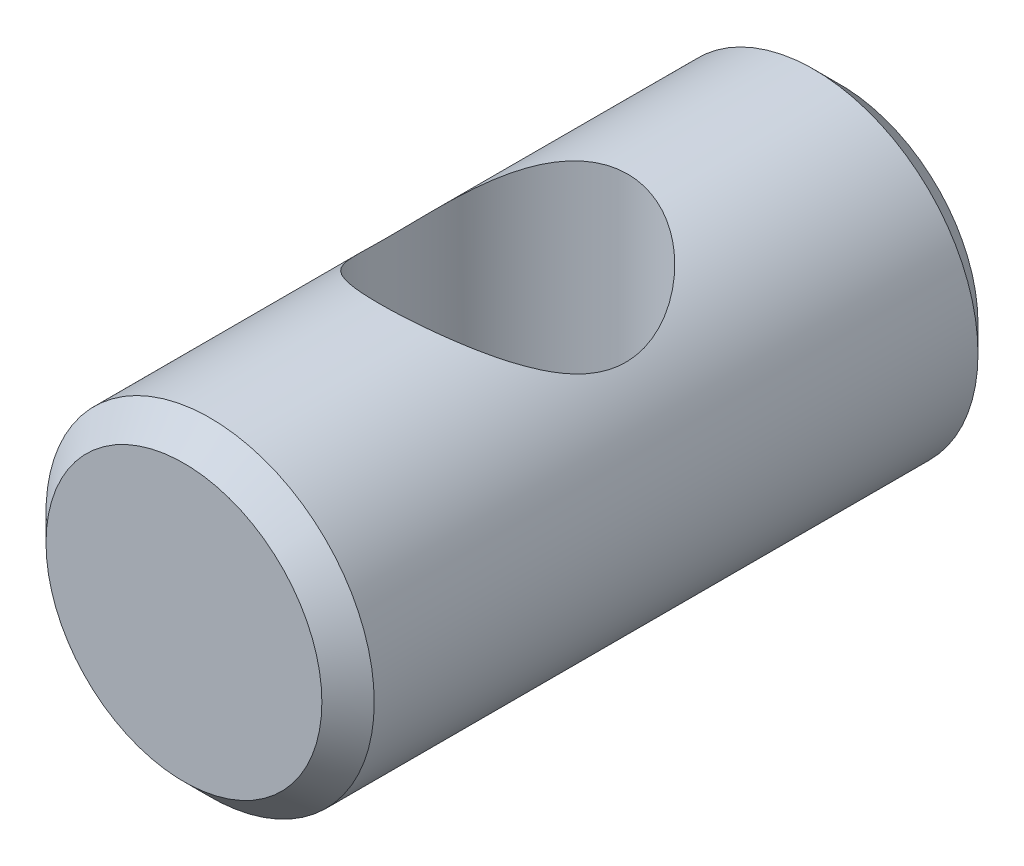
ISO-10303-21;
HEADER;
FILE_DESCRIPTION(('STEP AP214'),'2;1');
FILE_NAME('part.step','',(''),(''),'','','');
FILE_SCHEMA(('AUTOMOTIVE_DESIGN { 1 0 10303 214 1 1 1 1 }'));
ENDSEC;
DATA;
#1=APPLICATION_CONTEXT('core data for automotive mechanical design processes');
#2=APPLICATION_PROTOCOL_DEFINITION('international standard','automotive_design',2000,#1);
#3=PRODUCT_CONTEXT('',#1,'mechanical');
#4=PRODUCT('Part','Part','',(#3));
#5=PRODUCT_RELATED_PRODUCT_CATEGORY('part','',(#4));
#6=PRODUCT_DEFINITION_FORMATION('','',#4);
#7=PRODUCT_DEFINITION_CONTEXT('part definition',#1,'design');
#8=PRODUCT_DEFINITION('design','',#6,#7);
#9=PRODUCT_DEFINITION_SHAPE('','',#8);
#10=(LENGTH_UNIT() NAMED_UNIT(*) SI_UNIT(.MILLI.,.METRE.));
#11=(NAMED_UNIT(*) PLANE_ANGLE_UNIT() SI_UNIT($,.RADIAN.));
#12=(NAMED_UNIT(*) SI_UNIT($,.STERADIAN.) SOLID_ANGLE_UNIT());
#13=UNCERTAINTY_MEASURE_WITH_UNIT(LENGTH_MEASURE(1.E-05),#10,'distance_accuracy_value','');
#14=(GEOMETRIC_REPRESENTATION_CONTEXT(3) GLOBAL_UNCERTAINTY_ASSIGNED_CONTEXT((#13)) GLOBAL_UNIT_ASSIGNED_CONTEXT((#10,
#11,#12)) REPRESENTATION_CONTEXT('',''));
#15=CARTESIAN_POINT('',(0.,0.,0.));
#16=DIRECTION('',(0.,0.,1.));
#17=DIRECTION('',(1.,0.,0.));
#18=AXIS2_PLACEMENT_3D('',#15,#16,#17);
#19=CARTESIAN_POINT('',(0.,0.,9.525));
#20=DIRECTION('',(0.,0.,-1.));
#21=DIRECTION('',(-1.,0.,0.));
#22=AXIS2_PLACEMENT_3D('',#19,#20,#21);
#23=CYLINDRICAL_SURFACE('',#22,4.765);
#24=CARTESIAN_POINT('',(0.,0.,8.76500000000001));
#25=DIRECTION('',(0.,0.,1.));
#26=DIRECTION('',(1.,0.,0.));
#27=AXIS2_PLACEMENT_3D('',#24,#25,#26);
#28=CIRCLE('',#27,4.765);
#29=CARTESIAN_POINT('',(4.765,0.,8.76500000000001));
#30=VERTEX_POINT('',#29);
#31=EDGE_CURVE('E51',#30,#30,#28,.F.);
#32=ORIENTED_EDGE('',*,*,#31,.T.);
#33=EDGE_LOOP('',(#32));
#34=FACE_BOUND('',#33,.T.);
#35=CARTESIAN_POINT('',(0.,0.,-8.76499999999999));
#36=DIRECTION('',(0.,0.,1.));
#37=DIRECTION('',(1.,0.,0.));
#38=AXIS2_PLACEMENT_3D('',#35,#36,#37);
#39=CIRCLE('',#38,4.765);
#40=CARTESIAN_POINT('',(4.765,0.,-8.76499999999999));
#41=VERTEX_POINT('',#40);
#42=EDGE_CURVE('E55',#41,#41,#39,.T.);
#43=ORIENTED_EDGE('',*,*,#42,.T.);
#44=EDGE_LOOP('',(#43));
#45=FACE_BOUND('',#44,.T.);
#46=CARTESIAN_POINT('',(0.,-4.765,-3.42772154645035));
#47=CARTESIAN_POINT('',(-0.0839865096267768,-4.76499923945096,-3.43078352283502));
#48=CARTESIAN_POINT('',(-0.168111227726531,-4.76277384226055,-3.43075547265941));
#49=CARTESIAN_POINT('',(-0.335933742843372,-4.75388726745217,-3.42453891646178));
#50=CARTESIAN_POINT('',(-0.419631240230919,-4.74722331881857,-3.41834656082987));
#51=CARTESIAN_POINT('',(-0.586065447847459,-4.72956274970578,-3.3999026670684));
#52=CARTESIAN_POINT('',(-0.668799961995496,-4.71855769151854,-3.38763931698782));
#53=CARTESIAN_POINT('',(-0.832541225212306,-4.69243984617155,-3.3572658154081));
#54=CARTESIAN_POINT('',(-0.913547197089204,-4.67732525156167,-3.33915309058606));
#55=CARTESIAN_POINT('',(-1.152157226543,-4.62644701001912,-3.27669135386083));
#56=CARTESIAN_POINT('',(-1.30649192280341,-4.58502230599632,-3.22408720409129));
#57=CARTESIAN_POINT('',(-1.60281674673903,-4.49004370047634,-3.09949385091904));
#58=CARTESIAN_POINT('',(-1.74481022065447,-4.43649310112209,-3.02750992404124));
#59=CARTESIAN_POINT('',(-2.02642332709949,-4.315583972973,-2.85982346861991));
#60=CARTESIAN_POINT('',(-2.16480404638311,-4.24743669402915,-2.76262010183223));
#61=CARTESIAN_POINT('',(-2.42419857029939,-4.10492554798454,-2.55082100719969));
#62=CARTESIAN_POINT('',(-2.54518889881859,-4.03055348799905,-2.43620219065537));
#63=CARTESIAN_POINT('',(-2.7240896829084,-3.91038411625388,-2.24042645140578));
#64=CARTESIAN_POINT('',(-2.78786508536595,-3.86506427474399,-2.16423854414419));
#65=CARTESIAN_POINT('',(-2.90873820561481,-3.7749364414552,-2.00638642003802));
#66=CARTESIAN_POINT('',(-2.96583407789538,-3.7301285942081,-1.92472069946916));
#67=CARTESIAN_POINT('',(-3.07304460647211,-3.64230955335182,-1.75610578138991));
#68=CARTESIAN_POINT('',(-3.12316447346973,-3.59929703572482,-1.66916059783839));
#69=CARTESIAN_POINT('',(-3.21611205675316,-3.51649336836705,-1.49000247800149));
#70=CARTESIAN_POINT('',(-3.2589405459483,-3.476701877432,-1.39779010144108));
#71=CARTESIAN_POINT('',(-3.3511808523705,-3.3882512001599,-1.17318049082605));
#72=CARTESIAN_POINT('',(-3.39720196333177,-3.34172836953754,-1.03849784774334));
#73=CARTESIAN_POINT('',(-3.47269367130561,-3.26322686826511,-0.760552545401707));
#74=CARTESIAN_POINT('',(-3.50219977332418,-3.23121702506465,-0.617309030887489));
#75=CARTESIAN_POINT('',(-3.53270448650271,-3.19772373184532,-0.397538118253411));
#76=CARTESIAN_POINT('',(-3.54058527690804,-3.18897174669803,-0.323006058596948));
#77=CARTESIAN_POINT('',(-3.55144762173579,-3.17687221744638,-0.173165106953329));
#78=CARTESIAN_POINT('',(-3.55443158530634,-3.17352201577877,-0.0978566153190003));
#79=CARTESIAN_POINT('',(-3.55542072152195,-3.17241370521836,0.052841855413213));
#80=CARTESIAN_POINT('',(-3.55342542859932,-3.17465611924322,0.128231841472143));
#81=CARTESIAN_POINT('',(-3.54451602925269,-3.18459911003059,0.278336467083943));
#82=CARTESIAN_POINT('',(-3.53760202468256,-3.19229957377094,0.353051120588768));
#83=CARTESIAN_POINT('',(-3.5122031612924,-3.22028699594324,0.555349986686917));
#84=CARTESIAN_POINT('',(-3.48895505896966,-3.2456594214966,0.681675578959342));
#85=CARTESIAN_POINT('',(-3.42950672581975,-3.30840698699909,0.92805035697015));
#86=CARTESIAN_POINT('',(-3.39329228698404,-3.3457952888593,1.04809249149874));
#87=CARTESIAN_POINT('',(-3.28502484576081,-3.45288634551864,1.34803211786055));
#88=CARTESIAN_POINT('',(-3.20433930102703,-3.52880613731107,1.52264092810994));
#89=CARTESIAN_POINT('',(-3.06441681847619,-3.64944281467532,1.77024219757375));
#90=CARTESIAN_POINT('',(-3.01453463026471,-3.69085086937194,1.85050422025883));
#91=CARTESIAN_POINT('',(-2.90865879719905,-3.77484934058169,2.00624004632153));
#92=CARTESIAN_POINT('',(-2.85266607778969,-3.81743957732589,2.0817145720391));
#93=CARTESIAN_POINT('',(-2.67244716027593,-3.94786021314228,2.30492871045362));
#94=CARTESIAN_POINT('',(-2.5385704679292,-4.03600199533557,2.44487763591519));
#95=CARTESIAN_POINT('',(-2.2469478534188,-4.20533978398124,2.70183721097503));
#96=CARTESIAN_POINT('',(-2.08923820166202,-4.28654605628758,2.81888210649135));
#97=CARTESIAN_POINT('',(-1.77696036984332,-4.42403487057518,3.01066743009566));
#98=CARTESIAN_POINT('',(-1.62556411669789,-4.48222965871212,3.08913478602461));
#99=CARTESIAN_POINT('',(-1.38810160846322,-4.55909600309716,3.1901249127127));
#100=CARTESIAN_POINT('',(-1.30719253365645,-4.58298630809607,3.22101016857638));
#101=CARTESIAN_POINT('',(-1.14232413181176,-4.62683280617205,3.27681457878682));
#102=CARTESIAN_POINT('',(-1.05836618972262,-4.64679075968908,3.30173640392614));
#103=CARTESIAN_POINT('',(-0.887275366826237,-4.68248463436654,3.34539832903683));
#104=CARTESIAN_POINT('',(-0.800123371254775,-4.69818770775739,3.36409057738042));
#105=CARTESIAN_POINT('',(-0.623955464443576,-4.72481072543679,3.39469177521195));
#106=CARTESIAN_POINT('',(-0.534940468742363,-4.73573296391689,3.40660397908327));
#107=CARTESIAN_POINT('',(-0.355792764842245,-4.75254898375164,3.42340780234934));
#108=CARTESIAN_POINT('',(-0.265660351684302,-4.75844406494089,3.42830123675828));
#109=CARTESIAN_POINT('',(-0.0851322193469737,-4.76509753302669,3.4309582607748));
#110=CARTESIAN_POINT('',(0.00526347154228014,-4.76585645282716,3.42872259010015));
#111=CARTESIAN_POINT('',(0.254758426313915,-4.7608421470029,3.41263797194556));
#112=CARTESIAN_POINT('',(0.413351335680927,-4.74960975007475,3.39119414876476));
#113=CARTESIAN_POINT('',(0.724216096563906,-4.71225266498165,3.32700923018752));
#114=CARTESIAN_POINT('',(0.876487037139098,-4.68612583859358,3.28426507705693));
#115=CARTESIAN_POINT('',(1.17337025943492,-4.62080650100163,3.17872658903413));
#116=CARTESIAN_POINT('',(1.31784565102539,-4.58143637339387,3.1156602081457));
#117=CARTESIAN_POINT('',(1.59438898930468,-4.49269110061429,2.97202178851308));
#118=CARTESIAN_POINT('',(1.72645467905067,-4.44331414064252,2.89144657424369));
#119=CARTESIAN_POINT('',(1.99535856922343,-4.32990704386895,2.70183674928564));
#120=CARTESIAN_POINT('',(2.13000485836385,-4.2647897850878,2.59035433447761));
#121=CARTESIAN_POINT('',(2.38013939270978,-4.13041711575093,2.34934473567743));
#122=CARTESIAN_POINT('',(2.49559208547479,-4.06115434205378,2.21978486513491));
#123=CARTESIAN_POINT('',(2.66223289375173,-3.95261139916941,2.00161721394957));
#124=CARTESIAN_POINT('',(2.72019325413244,-3.91282917672993,1.91835667624683));
#125=CARTESIAN_POINT('',(2.82884075841981,-3.83501707455865,1.74644953045949));
#126=CARTESIAN_POINT('',(2.87952595791296,-3.79698766513356,1.65780149144891));
#127=CARTESIAN_POINT('',(3.01989986408227,-3.68773692314818,1.38431914172048));
#128=CARTESIAN_POINT('',(3.09831352844662,-3.62107370959085,1.19141871588694));
#129=CARTESIAN_POINT('',(3.20034170057196,-3.53074164469778,0.852909000394646));
#130=CARTESIAN_POINT('',(3.23346636995276,-3.50014067226467,0.711986567883186));
#131=CARTESIAN_POINT('',(3.28170797802449,-3.45495839998085,0.424682408298381));
#132=CARTESIAN_POINT('',(3.29685948419948,-3.44034635311092,0.278311721082316));
#133=CARTESIAN_POINT('',(3.3081391369101,-3.42950760195775,-0.0164069595178661));
#134=CARTESIAN_POINT('',(3.30419829447083,-3.43334757244576,-0.164760189092545));
#135=CARTESIAN_POINT('',(3.27745035607889,-3.45888000248391,-0.458278225707179));
#136=CARTESIAN_POINT('',(3.25461759914431,-3.48059674393644,-0.603438420161686));
#137=CARTESIAN_POINT('',(3.1851490660388,-3.54438496223023,-0.9156069316259));
#138=CARTESIAN_POINT('',(3.13462072861776,-3.58969468693944,-1.08106477444573));
#139=CARTESIAN_POINT('',(3.01139939197799,-3.69366556570727,-1.39896081870162));
#140=CARTESIAN_POINT('',(2.93867387295435,-3.75234627663868,-1.55137949493086));
#141=CARTESIAN_POINT('',(2.77150763521986,-3.87751162941273,-1.84506688343997));
#142=CARTESIAN_POINT('',(2.67663983362026,-3.94413517173465,-1.98603127432888));
#143=CARTESIAN_POINT('',(2.46748844161229,-4.0782612490041,-2.25224434022066));
#144=CARTESIAN_POINT('',(2.35319678206062,-4.14576413844892,-2.37748644605533));
#145=CARTESIAN_POINT('',(2.07914603363859,-4.29082944744582,-2.63615291077554));
#146=CARTESIAN_POINT('',(1.9148989346157,-4.36741256836819,-2.76549474858921));
#147=CARTESIAN_POINT('',(1.64991355529308,-4.47124783629732,-2.93694771843601));
#148=CARTESIAN_POINT('',(1.55846209446512,-4.50402524686314,-2.99034733009183));
#149=CARTESIAN_POINT('',(1.36982626952791,-4.56493429957106,-3.08896867321141));
#150=CARTESIAN_POINT('',(1.27264452728282,-4.59306804435549,-3.13419410681268));
#151=CARTESIAN_POINT('',(1.02506635965482,-4.65592144192643,-3.23537405101476));
#152=CARTESIAN_POINT('',(0.871546232174111,-4.68730571676444,-3.28603521206717));
#153=CARTESIAN_POINT('',(0.635805151441285,-4.72306322246469,-3.34554399404055));
#154=CARTESIAN_POINT('',(0.556392870022323,-4.73309172486031,-3.36262464612005));
#155=CARTESIAN_POINT('',(0.396173567694385,-4.74918211666351,-3.39114718768474));
#156=CARTESIAN_POINT('',(0.315367356759777,-4.75524623493566,-3.40259224473141));
#157=CARTESIAN_POINT('',(0.195290153394113,-4.76115607437116,-3.41523744530084));
#158=CARTESIAN_POINT('',(0.156313176188726,-4.76259553069938,-3.41866854107117));
#159=CARTESIAN_POINT('',(0.0782341478778366,-4.76451775469641,-3.42419737100883));
#160=CARTESIAN_POINT('',(0.0391320760157082,-4.7650003543648,-3.42629487098574));
#161=CARTESIAN_POINT('',(0.,-4.765,-3.42772154645035));
#162=B_SPLINE_CURVE_WITH_KNOTS('',3,(#46,#47,#48,#49,#50,#51,#52,#53,#54,#55,#56,#57,#58,#59,
#60,#61,#62,#63,#64,#65,#66,#67,#68,#69,#70,#71,#72,#73,#74,#75,#76,#77,#78,#79,#80,#81,#82,#83,
#84,#85,#86,#87,#88,#89,#90,#91,#92,#93,#94,#95,#96,#97,#98,#99,#100,#101,#102,#103,#104,#105,
#106,#107,#108,#109,#110,#111,#112,#113,#114,#115,#116,#117,#118,#119,#120,#121,#122,#123,#124,
#125,#126,#127,#128,#129,#130,#131,#132,#133,#134,#135,#136,#137,#138,#139,#140,#141,#142,#143,
#144,#145,#146,#147,#148,#149,#150,#151,#152,#153,#154,#155,#156,#157,#158,#159,#160,#161),
.UNSPECIFIED.,.T.,.F.,(4,2,2,2,2,2,2,2,2,2,2,2,2,2,2,2,2,2,2,2,2,2,2,2,2,2,2,2,2,2,2,2,2,2,2,2,
2,2,2,2,2,2,2,2,2,2,2,2,2,2,2,2,2,2,2,2,2,4),(0.,0.252084492489864,0.504326510614384,
0.757061240431479,1.009907307972,1.51218541014415,2.01432689529945,2.5593626916246,
3.1051274830064,3.43244807330464,3.75985888762814,4.08702381593729,4.41415404209607,
4.86184335458953,5.30856646277174,5.53462910461257,5.76058049443999,5.98655301184048,
6.21252085006784,6.60359766314461,6.99510432112349,7.61181030171615,7.9211266064393,
8.23039612980449,8.86603500005162,9.50071608201361,10.0388448313654,10.3080773904034,
10.5771891438402,10.8483227999649,11.1193262034623,11.3902595143662,11.6611647140751,
12.1399440132132,12.6187920625415,13.1043369063569,13.5899698856111,14.1475539868604,
14.70615966733,15.0327016368544,15.3593307185489,16.0104477602024,16.4526357067076,
16.8939718144919,17.3369038488548,17.7804385095947,18.3140553762704,18.8484577974265,
19.3941725264432,19.9401145152832,20.6040583117158,20.9361656686363,21.2681222330304,
21.7596550138743,22.0049545755179,22.250116105438,22.3675499414817,22.4850043941829),.UNSPECIFIED.);
#163=CARTESIAN_POINT('',(0.,-4.765,-3.42772154645035));
#164=VERTEX_POINT('',#163);
#165=EDGE_CURVE('E64',#164,#164,#162,.T.);
#166=ORIENTED_EDGE('',*,*,#165,.T.);
#167=EDGE_LOOP('',(#166));
#168=FACE_BOUND('',#167,.T.);
#169=CARTESIAN_POINT('',(-0.125,4.76336015854355,3.43));
#170=CARTESIAN_POINT('',(-0.210389699482341,4.76111949964861,3.43000014694567));
#171=CARTESIAN_POINT('',(-0.295716694318499,4.75657767350802,3.42680674978377));
#172=CARTESIAN_POINT('',(-0.46556702128159,4.74296690012576,3.4141134342341));
#173=CARTESIAN_POINT('',(-0.550090023706455,4.73389617087404,3.40461103292532));
#174=CARTESIAN_POINT('',(-0.717629178365099,4.71140890786757,3.37947679304023));
#175=CARTESIAN_POINT('',(-0.800645377807264,4.69799251051237,3.36384514684219));
#176=CARTESIAN_POINT('',(-0.964596234458366,4.66709275679765,3.3267185713492));
#177=CARTESIAN_POINT('',(-1.04552996368931,4.64960762105083,3.30522107602182));
#178=CARTESIAN_POINT('',(-1.28347185742015,4.59177330698621,3.23267276500996));
#179=CARTESIAN_POINT('',(-1.43672348659311,4.54589063893149,3.17339484215341));
#180=CARTESIAN_POINT('',(-1.72992755347538,4.44261430926426,3.03569097813792));
#181=CARTESIAN_POINT('',(-1.86987896991551,4.38521976475249,2.95726356821554));
#182=CARTESIAN_POINT('',(-2.14812086828319,4.25635300139335,2.77527678667895));
#183=CARTESIAN_POINT('',(-2.28490183893374,4.18405213097418,2.67000681286781));
#184=CARTESIAN_POINT('',(-2.53998040204968,4.03430606288924,2.44174950665104));
#185=CARTESIAN_POINT('',(-2.65824607755239,3.95685230298786,2.31873226742908));
#186=CARTESIAN_POINT('',(-2.83158722215179,3.83323628366744,2.1094101832199));
#187=CARTESIAN_POINT('',(-2.89294323258027,3.78702111199538,2.02824596800638));
#188=CARTESIAN_POINT('',(-3.00853538754771,3.69585601482599,1.86024852328497));
#189=CARTESIAN_POINT('',(-3.06276924066806,3.6509065001659,1.7734134826853));
#190=CARTESIAN_POINT('',(-3.16367728956706,3.56381897050582,1.59432862573631));
#191=CARTESIAN_POINT('',(-3.2103642241935,3.52167628994017,1.50208829965763));
#192=CARTESIAN_POINT('',(-3.29579729619162,3.44185458691824,1.31216880138888));
#193=CARTESIAN_POINT('',(-3.33454528841865,3.4041745226859,1.21449090643083));
#194=CARTESIAN_POINT('',(-3.41289662160247,3.32584086855456,0.986346315551637));
#195=CARTESIAN_POINT('',(-3.44982781690385,3.28719920416431,0.854226176886961));
#196=CARTESIAN_POINT('',(-3.50787239477605,3.22519725044824,0.583257094003947));
#197=CARTESIAN_POINT('',(-3.52902177669779,3.20180219814824,0.444424237650357));
#198=CARTESIAN_POINT('',(-3.55410881973246,3.17394572647517,0.162145326102542));
#199=CARTESIAN_POINT('',(-3.5579163447771,3.16962746965939,0.0186725017018117));
#200=CARTESIAN_POINT('',(-3.54759306521559,3.1811705897006,-0.266847408658702));
#201=CARTESIAN_POINT('',(-3.53344855635861,3.19704738310604,-0.408893321871561));
#202=CARTESIAN_POINT('',(-3.48562643470747,3.24915258938762,-0.704454363730791));
#203=CARTESIAN_POINT('',(-3.44972888203151,3.28767617300935,-0.85718471386662));
#204=CARTESIAN_POINT('',(-3.35934939039569,3.37995855166946,-1.15231589785837));
#205=CARTESIAN_POINT('',(-3.30482233849687,3.43375427554022,-1.29469062997595));
#206=CARTESIAN_POINT('',(-3.19900657422322,3.53200534767869,-1.52513864316688));
#207=CARTESIAN_POINT('',(-3.15203592171802,3.57412203258166,-1.61627156999795));
#208=CARTESIAN_POINT('',(-3.05075538892201,3.6609508734778,-1.79310896215204));
#209=CARTESIAN_POINT('',(-2.99644319832732,3.70566384395754,-1.8788117061346));
#210=CARTESIAN_POINT('',(-2.88075057027231,3.79630212621872,-2.04474411742604));
#211=CARTESIAN_POINT('',(-2.819363683971,3.84222851421551,-2.12496868341069));
#212=CARTESIAN_POINT('',(-2.68975557152496,3.93404983924117,-2.27971798609541));
#213=CARTESIAN_POINT('',(-2.62153418749183,3.97994477551878,-2.35424259104664));
#214=CARTESIAN_POINT('',(-2.47721641114854,4.07136842844485,-2.49851130779713));
#215=CARTESIAN_POINT('',(-2.40100812764841,4.11687843078085,-2.56815557248693));
#216=CARTESIAN_POINT('',(-2.24185105418913,4.20566676990228,-2.70084700950556));
#217=CARTESIAN_POINT('',(-2.15890310165715,4.24894538285658,-2.7638949992241));
#218=CARTESIAN_POINT('',(-1.98662442720089,4.33216768959507,-2.8827380980267));
#219=CARTESIAN_POINT('',(-1.89730540556084,4.37211721866827,-2.93854599759476));
#220=CARTESIAN_POINT('',(-1.71256855255707,4.44773028558645,-3.04232743194355));
#221=CARTESIAN_POINT('',(-1.61715296340942,4.48339538543162,-3.0903038242072));
#222=CARTESIAN_POINT('',(-1.37203270364528,4.56581742006728,-3.19931123967896));
#223=CARTESIAN_POINT('',(-1.2188070429568,4.60934231809246,-3.25507213902556));
#224=CARTESIAN_POINT('',(-0.902788603175401,4.68149897598064,-3.34468011199159));
#225=CARTESIAN_POINT('',(-0.740002945007231,4.71014166835211,-3.3785432762316));
#226=CARTESIAN_POINT('',(-0.408387340883131,4.75041328155052,-3.42237542261032));
#227=CARTESIAN_POINT('',(-0.239534615227551,4.76196925873958,-3.43224207782235));
#228=CARTESIAN_POINT('',(0.0980431575260026,4.76698032493306,-3.4268996977203));
#229=CARTESIAN_POINT('',(0.266768210568429,4.76043631612033,-3.4116919122418));
#230=CARTESIAN_POINT('',(0.587324447349581,4.7312203076774,-3.35888436131468));
#231=CARTESIAN_POINT('',(0.739526595398385,4.7096685459987,-3.32286790636238));
#232=CARTESIAN_POINT('',(1.03542356279234,4.65358152779625,-3.23145714387915));
#233=CARTESIAN_POINT('',(1.17911677906806,4.61904383369424,-3.17605919840098));
#234=CARTESIAN_POINT('',(1.46508224787842,4.53678565766234,-3.04353300108533));
#235=CARTESIAN_POINT('',(1.60655474390211,4.48831309387078,-2.96515755296377));
#236=CARTESIAN_POINT('',(1.87499623054519,4.38297220518994,-2.7911544060454));
#237=CARTESIAN_POINT('',(2.00195607839745,4.32609863893186,-2.69551592854979));
#238=CARTESIAN_POINT('',(2.26080551812362,4.19741477162723,-2.47123588245276));
#239=CARTESIAN_POINT('',(2.38978734893812,4.12471786357957,-2.3397471517146));
#240=CARTESIAN_POINT('',(2.62521900314773,3.97902271030047,-2.05790087439167));
#241=CARTESIAN_POINT('',(2.73165080610247,3.90602427124015,-1.90752838888597));
#242=CARTESIAN_POINT('',(2.9116498747525,3.77343999790828,-1.60372361816979));
#243=CARTESIAN_POINT('',(2.98732749414279,3.71323810730147,-1.45181736250369));
#244=CARTESIAN_POINT('',(3.11639841849071,3.60560263861728,-1.13464111746318));
#245=CARTESIAN_POINT('',(3.16983526941768,3.55814417504587,-0.969398005800966));
#246=CARTESIAN_POINT('',(3.24354234327506,3.49094021785452,-0.661607330682173));
#247=CARTESIAN_POINT('',(3.26825195882027,3.46759243920868,-0.520930532277694));
#248=CARTESIAN_POINT('',(3.29987152952377,3.43752550044397,-0.235899852411659));
#249=CARTESIAN_POINT('',(3.30680334918626,3.43078591468876,-0.0915507084758094));
#250=CARTESIAN_POINT('',(3.30239085090439,3.43503173632163,0.196693201054746));
#251=CARTESIAN_POINT('',(3.29103351413393,3.44602976994203,0.340587569857622));
#252=CARTESIAN_POINT('',(3.25083676039393,3.48396541101487,0.623828498768893));
#253=CARTESIAN_POINT('',(3.22197131563332,3.51092674830585,0.763167961840183));
#254=CARTESIAN_POINT('',(3.13740857333404,3.58691694791858,1.07461244945723));
#255=CARTESIAN_POINT('',(3.07629807681025,3.64011558155585,1.24420748225821));
#256=CARTESIAN_POINT('',(2.93058157449229,3.75841783893898,1.56845271016017));
#257=CARTESIAN_POINT('',(2.84593923981305,3.82353981665682,1.72307929503218));
#258=CARTESIAN_POINT('',(2.6531169843644,3.95985847335538,2.01964276085398));
#259=CARTESIAN_POINT('',(2.54444110883469,4.03116032152088,2.16120661993959));
#260=CARTESIAN_POINT('',(2.305922213917,4.17218507081843,2.42637378305909));
#261=CARTESIAN_POINT('',(2.17607233735347,4.24190745208324,2.54997124408802));
#262=CARTESIAN_POINT('',(1.95541107772961,4.34622031234347,2.72903827635316));
#263=CARTESIAN_POINT('',(1.87116840324555,4.38324728147179,2.79128867608083));
#264=CARTESIAN_POINT('',(1.69633593467225,4.45382309350543,2.90838330030763));
#265=CARTESIAN_POINT('',(1.60574916462617,4.48737357489196,2.96323101743926));
#266=CARTESIAN_POINT('',(1.41875750858233,4.5499523251104,3.06480399209829));
#267=CARTESIAN_POINT('',(1.32235813182922,4.57898478551632,3.11153678293269));
#268=CARTESIAN_POINT('',(1.12434304973075,4.63158269627918,3.1961888567106));
#269=CARTESIAN_POINT('',(1.02272917790882,4.65515005240928,3.23411121200885));
#270=CARTESIAN_POINT('',(0.835722721415005,4.69190775244756,3.29386636760276));
#271=CARTESIAN_POINT('',(0.751091207976156,4.70622833556762,3.31739770170882));
#272=CARTESIAN_POINT('',(0.579670924675314,4.73040094339669,3.35798925949897));
#273=CARTESIAN_POINT('',(0.492882612116946,4.74025390698568,3.37505084269182));
#274=CARTESIAN_POINT('',(0.3179087166459,4.75519328810745,3.40243554707507));
#275=CARTESIAN_POINT('',(0.229724235986339,4.76028329205765,3.41276373660175));
#276=CARTESIAN_POINT('',(0.0526705617580229,4.76553180053352,3.42654586154866));
#277=CARTESIAN_POINT('',(-0.0361986268043523,4.76569034108242,3.42999984718324));
#278=CARTESIAN_POINT('',(-0.125,4.76336015854355,3.43));
#279=B_SPLINE_CURVE_WITH_KNOTS('',3,(#169,#170,#171,#172,#173,#174,#175,#176,#177,#178,#179,
#180,#181,#182,#183,#184,#185,#186,#187,#188,#189,#190,#191,#192,#193,#194,#195,#196,#197,#198,
#199,#200,#201,#202,#203,#204,#205,#206,#207,#208,#209,#210,#211,#212,#213,#214,#215,#216,#217,
#218,#219,#220,#221,#222,#223,#224,#225,#226,#227,#228,#229,#230,#231,#232,#233,#234,#235,#236,
#237,#238,#239,#240,#241,#242,#243,#244,#245,#246,#247,#248,#249,#250,#251,#252,#253,#254,#255,
#256,#257,#258,#259,#260,#261,#262,#263,#264,#265,#266,#267,#268,#269,#270,#271,#272,#273,#274,
#275,#276,#277,#278),.UNSPECIFIED.,.T.,.F.,(4,2,2,2,2,2,2,2,2,2,2,2,2,2,2,2,2,2,2,2,2,2,2,2,2,2,
2,2,2,2,2,2,2,2,2,2,2,2,2,2,2,2,2,2,2,2,2,2,2,2,2,2,2,2,4),(0.,0.256163604038321,
0.512428081573091,0.768684516392368,1.02505323153767,1.53445441567035,2.0438946830949,
2.60330641754139,3.16367210182863,3.49860028455959,3.83363596143441,4.16810007123641,
4.50248594747221,4.92845197975161,5.35344336015305,5.78161874542313,6.21012118855237,
6.69216795084687,7.17539040333912,7.50752542971783,7.83976521984242,8.17231029027847,
8.50486304483709,8.84293410867927,9.18096323007293,9.51838680601181,9.85568698964424,
10.359722862388,10.8633879436491,11.3691970380925,11.874980921242,12.3465713991725,
12.8182504431771,13.3228635334235,13.827792791019,14.4195659306285,15.0118102059181,
15.5501144664737,16.087359747247,16.5196747603434,16.9514578235694,17.38354838014,
17.8162828681801,18.3771087797491,18.9388053590804,19.5134028359755,20.0881867665097,
20.4210750584584,20.7538057384388,21.0862258646744,21.4185298955521,21.6851872193838,
21.9517884785958,22.2181888302443,22.4845872358981),.UNSPECIFIED.);
#280=CARTESIAN_POINT('',(-0.125,4.76336015854355,3.43));
#281=VERTEX_POINT('',#280);
#282=EDGE_CURVE('E72',#281,#281,#279,.T.);
#283=ORIENTED_EDGE('',*,*,#282,.T.);
#284=EDGE_LOOP('',(#283));
#285=FACE_BOUND('',#284,.T.);
#286=ADVANCED_FACE('F43',(#34,#45,#168,#285),#23,.T.);
#287=CARTESIAN_POINT('',(0.,0.,9.525));
#288=DIRECTION('',(0.,0.,1.));
#289=DIRECTION('',(1.,0.,0.));
#290=AXIS2_PLACEMENT_3D('',#287,#288,#289);
#291=PLANE('',#290);
#292=CARTESIAN_POINT('',(0.,0.,9.525));
#293=DIRECTION('',(0.,0.,1.));
#294=DIRECTION('',(1.,0.,0.));
#295=AXIS2_PLACEMENT_3D('',#292,#293,#294);
#296=CIRCLE('',#295,4.00500000000001);
#297=CARTESIAN_POINT('',(4.00500000000001,0.,9.525));
#298=VERTEX_POINT('',#297);
#299=EDGE_CURVE('E59',#298,#298,#296,.T.);
#300=ORIENTED_EDGE('',*,*,#299,.T.);
#301=EDGE_LOOP('',(#300));
#302=FACE_BOUND('',#301,.T.);
#303=ADVANCED_FACE('F85',(#302),#291,.T.);
#304=CARTESIAN_POINT('',(0.,0.,-9.525));
#305=DIRECTION('',(0.,0.,1.));
#306=DIRECTION('',(1.,0.,0.));
#307=AXIS2_PLACEMENT_3D('',#304,#305,#306);
#308=PLANE('',#307);
#309=CARTESIAN_POINT('',(0.,0.,-9.525));
#310=DIRECTION('',(0.,0.,1.));
#311=DIRECTION('',(1.,0.,0.));
#312=AXIS2_PLACEMENT_3D('',#309,#310,#311);
#313=CIRCLE('',#312,4.00499999999998);
#314=CARTESIAN_POINT('',(4.00499999999998,0.,-9.525));
#315=VERTEX_POINT('',#314);
#316=EDGE_CURVE('E10',#315,#315,#313,.F.);
#317=ORIENTED_EDGE('',*,*,#316,.T.);
#318=EDGE_LOOP('',(#317));
#319=FACE_BOUND('',#318,.T.);
#320=ADVANCED_FACE('F83',(#319),#308,.F.);
#321=CARTESIAN_POINT('',(-0.125,-4.765,0.));
#322=DIRECTION('',(0.,1.,0.));
#323=DIRECTION('',(0.,0.,1.));
#324=AXIS2_PLACEMENT_3D('',#321,#322,#323);
#325=CYLINDRICAL_SURFACE('',#324,3.43);
#326=ORIENTED_EDGE('',*,*,#282,.F.);
#327=EDGE_LOOP('',(#326));
#328=FACE_BOUND('',#327,.T.);
#329=ORIENTED_EDGE('',*,*,#165,.F.);
#330=EDGE_LOOP('',(#329));
#331=FACE_BOUND('',#330,.T.);
#332=ADVANCED_FACE('F78',(#328,#331),#325,.F.);
#333=CARTESIAN_POINT('',(0.,0.,9.525));
#334=DIRECTION('',(0.,0.,-1.));
#335=DIRECTION('',(-1.,0.,0.));
#336=AXIS2_PLACEMENT_3D('',#333,#334,#335);
#337=CONICAL_SURFACE('',#336,4.00500000000001,0.785398163397448);
#338=ORIENTED_EDGE('',*,*,#31,.F.);
#339=EDGE_LOOP('',(#338));
#340=FACE_BOUND('',#339,.T.);
#341=ORIENTED_EDGE('',*,*,#299,.F.);
#342=EDGE_LOOP('',(#341));
#343=FACE_BOUND('',#342,.T.);
#344=ADVANCED_FACE('F82',(#340,#343),#337,.T.);
#345=CARTESIAN_POINT('',(0.,0.,-8.76499999999999));
#346=DIRECTION('',(0.,0.,1.));
#347=DIRECTION('',(1.,0.,0.));
#348=AXIS2_PLACEMENT_3D('',#345,#346,#347);
#349=CONICAL_SURFACE('',#348,4.765,0.785398163397451);
#350=ORIENTED_EDGE('',*,*,#316,.F.);
#351=EDGE_LOOP('',(#350));
#352=FACE_BOUND('',#351,.T.);
#353=ORIENTED_EDGE('',*,*,#42,.F.);
#354=EDGE_LOOP('',(#353));
#355=FACE_BOUND('',#354,.T.);
#356=ADVANCED_FACE('F46',(#352,#355),#349,.T.);
#357=CLOSED_SHELL('',(#286,#303,#320,#332,#344,#356));
#358=MANIFOLD_SOLID_BREP('B2',#357);
#359=ADVANCED_BREP_SHAPE_REPRESENTATION('',(#18,#358),#14);
#360=SHAPE_DEFINITION_REPRESENTATION(#9,#359);
ENDSEC;
END-ISO-10303-21;
